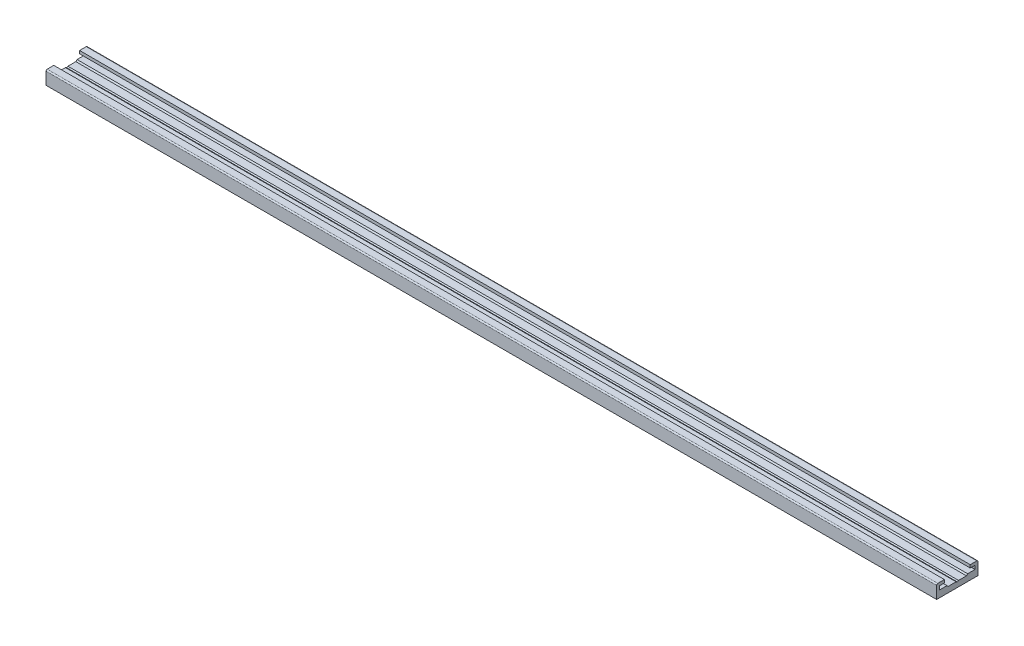
ISO-10303-21;
HEADER;
FILE_DESCRIPTION(('STEP AP214'),'2;1');
FILE_NAME('part.step','',(''),(''),'','','');
FILE_SCHEMA(('AUTOMOTIVE_DESIGN { 1 0 10303 214 1 1 1 1 }'));
ENDSEC;
DATA;
#1=APPLICATION_CONTEXT('core data for automotive mechanical design processes');
#2=APPLICATION_PROTOCOL_DEFINITION('international standard','automotive_design',2000,#1);
#3=PRODUCT_CONTEXT('',#1,'mechanical');
#4=PRODUCT('Part','Part','',(#3));
#5=PRODUCT_RELATED_PRODUCT_CATEGORY('part','',(#4));
#6=PRODUCT_DEFINITION_FORMATION('','',#4);
#7=PRODUCT_DEFINITION_CONTEXT('part definition',#1,'design');
#8=PRODUCT_DEFINITION('design','',#6,#7);
#9=PRODUCT_DEFINITION_SHAPE('','',#8);
#10=(LENGTH_UNIT() NAMED_UNIT(*) SI_UNIT(.MILLI.,.METRE.));
#11=(NAMED_UNIT(*) PLANE_ANGLE_UNIT() SI_UNIT($,.RADIAN.));
#12=(NAMED_UNIT(*) SI_UNIT($,.STERADIAN.) SOLID_ANGLE_UNIT());
#13=UNCERTAINTY_MEASURE_WITH_UNIT(LENGTH_MEASURE(1.E-05),#10,'distance_accuracy_value','');
#14=(GEOMETRIC_REPRESENTATION_CONTEXT(3) GLOBAL_UNCERTAINTY_ASSIGNED_CONTEXT((#13)) GLOBAL_UNIT_ASSIGNED_CONTEXT((#10,
#11,#12)) REPRESENTATION_CONTEXT('',''));
#15=CARTESIAN_POINT('',(0.,0.,0.));
#16=DIRECTION('',(0.,0.,1.));
#17=DIRECTION('',(1.,0.,0.));
#18=AXIS2_PLACEMENT_3D('',#15,#16,#17);
#19=CARTESIAN_POINT('',(366.,-2.75,8.49999999602077));
#20=DIRECTION('',(0.,0.,-1.));
#21=DIRECTION('',(0.,1.,0.));
#22=AXIS2_PLACEMENT_3D('',#19,#20,#21);
#23=PLANE('',#22);
#24=DIRECTION('',(0.,-1.,0.));
#25=VECTOR('',#24,1.);
#26=CARTESIAN_POINT('',(0.,-2.75,8.49999999602077));
#27=LINE('',#26,#25);
#28=CARTESIAN_POINT('',(0.,2.25,8.49999999602078));
#29=VERTEX_POINT('',#28);
#30=CARTESIAN_POINT('',(0.,-2.75,8.49999999602077));
#31=VERTEX_POINT('',#30);
#32=EDGE_CURVE('E207',#29,#31,#27,.T.);
#33=ORIENTED_EDGE('',*,*,#32,.T.);
#34=DIRECTION('',(-1.,0.,0.));
#35=VECTOR('',#34,1.);
#36=CARTESIAN_POINT('',(366.,-2.75,8.49999999602077));
#37=LINE('',#36,#35);
#38=CARTESIAN_POINT('',(366.,-2.75,8.49999999602077));
#39=VERTEX_POINT('',#38);
#40=EDGE_CURVE('E11',#39,#31,#37,.T.);
#41=ORIENTED_EDGE('',*,*,#40,.F.);
#42=DIRECTION('',(0.,-1.,0.));
#43=VECTOR('',#42,1.);
#44=CARTESIAN_POINT('',(366.,-2.75,8.49999999602077));
#45=LINE('',#44,#43);
#46=CARTESIAN_POINT('',(366.,2.25,8.49999999602078));
#47=VERTEX_POINT('',#46);
#48=EDGE_CURVE('E247',#47,#39,#45,.T.);
#49=ORIENTED_EDGE('',*,*,#48,.F.);
#50=DIRECTION('',(-1.,0.,0.));
#51=VECTOR('',#50,1.);
#52=CARTESIAN_POINT('',(366.,2.25,8.49999999602078));
#53=LINE('',#52,#51);
#54=EDGE_CURVE('E203',#47,#29,#53,.T.);
#55=ORIENTED_EDGE('',*,*,#54,.T.);
#56=EDGE_LOOP('',(#33,#41,#49,#55));
#57=FACE_BOUND('',#56,.T.);
#58=ADVANCED_FACE('F33',(#57),#23,.F.);
#59=CARTESIAN_POINT('',(366.,-2.75,8.49999999602077));
#60=DIRECTION('',(0.,1.,0.));
#61=DIRECTION('',(0.,0.,1.));
#62=AXIS2_PLACEMENT_3D('',#59,#60,#61);
#63=PLANE('',#62);
#64=DIRECTION('',(0.,0.,-1.));
#65=VECTOR('',#64,1.);
#66=CARTESIAN_POINT('',(0.,-2.75,8.49999999602077));
#67=LINE('',#66,#65);
#68=CARTESIAN_POINT('',(0.,-2.75,-8.49999999602077));
#69=VERTEX_POINT('',#68);
#70=EDGE_CURVE('E210',#31,#69,#67,.T.);
#71=ORIENTED_EDGE('',*,*,#70,.T.);
#72=DIRECTION('',(-1.,0.,0.));
#73=VECTOR('',#72,1.);
#74=CARTESIAN_POINT('',(366.,-2.75,-8.49999999602077));
#75=LINE('',#74,#73);
#76=CARTESIAN_POINT('',(366.,-2.75,-8.49999999602077));
#77=VERTEX_POINT('',#76);
#78=EDGE_CURVE('E41',#77,#69,#75,.T.);
#79=ORIENTED_EDGE('',*,*,#78,.F.);
#80=DIRECTION('',(0.,0.,-1.));
#81=VECTOR('',#80,1.);
#82=CARTESIAN_POINT('',(366.,-2.75,8.49999999602077));
#83=LINE('',#82,#81);
#84=EDGE_CURVE('E131',#39,#77,#83,.T.);
#85=ORIENTED_EDGE('',*,*,#84,.F.);
#86=ORIENTED_EDGE('',*,*,#40,.T.);
#87=EDGE_LOOP('',(#71,#79,#85,#86));
#88=FACE_BOUND('',#87,.T.);
#89=ADVANCED_FACE('F370',(#88),#63,.F.);
#90=CARTESIAN_POINT('',(366.,-2.75,-8.49999999602077));
#91=DIRECTION('',(0.,0.,1.));
#92=DIRECTION('',(1.,0.,0.));
#93=AXIS2_PLACEMENT_3D('',#90,#91,#92);
#94=PLANE('',#93);
#95=DIRECTION('',(0.,1.,0.));
#96=VECTOR('',#95,1.);
#97=CARTESIAN_POINT('',(0.,-2.75,-8.49999999602077));
#98=LINE('',#97,#96);
#99=CARTESIAN_POINT('',(0.,2.25,-8.49999999602077));
#100=VERTEX_POINT('',#99);
#101=EDGE_CURVE('E212',#69,#100,#98,.T.);
#102=ORIENTED_EDGE('',*,*,#101,.T.);
#103=DIRECTION('',(-1.,0.,0.));
#104=VECTOR('',#103,1.);
#105=CARTESIAN_POINT('',(366.,2.25,-8.49999999602077));
#106=LINE('',#105,#104);
#107=CARTESIAN_POINT('',(366.,2.25,-8.49999999602077));
#108=VERTEX_POINT('',#107);
#109=EDGE_CURVE('E293',#108,#100,#106,.T.);
#110=ORIENTED_EDGE('',*,*,#109,.F.);
#111=DIRECTION('',(0.,1.,0.));
#112=VECTOR('',#111,1.);
#113=CARTESIAN_POINT('',(366.,-2.75,-8.49999999602077));
#114=LINE('',#113,#112);
#115=EDGE_CURVE('E301',#77,#108,#114,.T.);
#116=ORIENTED_EDGE('',*,*,#115,.F.);
#117=ORIENTED_EDGE('',*,*,#78,.T.);
#118=EDGE_LOOP('',(#102,#110,#116,#117));
#119=FACE_BOUND('',#118,.T.);
#120=ADVANCED_FACE('F299',(#119),#94,.F.);
#121=CARTESIAN_POINT('',(366.,2.25,-7.99999999602077));
#122=DIRECTION('',(-1.,0.,0.));
#123=DIRECTION('',(0.,0.,1.));
#124=AXIS2_PLACEMENT_3D('',#121,#122,#123);
#125=CYLINDRICAL_SURFACE('',#124,0.5);
#126=CARTESIAN_POINT('',(0.,2.25,-7.99999999602077));
#127=DIRECTION('',(1.,0.,0.));
#128=DIRECTION('',(0.,0.,-1.));
#129=AXIS2_PLACEMENT_3D('',#126,#127,#128);
#130=CIRCLE('',#129,0.5);
#131=CARTESIAN_POINT('',(0.,2.75,-7.99999999602077));
#132=VERTEX_POINT('',#131);
#133=EDGE_CURVE('E214',#100,#132,#130,.T.);
#134=ORIENTED_EDGE('',*,*,#133,.T.);
#135=DIRECTION('',(-1.,0.,0.));
#136=VECTOR('',#135,1.);
#137=CARTESIAN_POINT('',(366.,2.75,-7.99999999602077));
#138=LINE('',#137,#136);
#139=CARTESIAN_POINT('',(366.,2.75,-7.99999999602077));
#140=VERTEX_POINT('',#139);
#141=EDGE_CURVE('E290',#140,#132,#138,.T.);
#142=ORIENTED_EDGE('',*,*,#141,.F.);
#143=CARTESIAN_POINT('',(366.,2.25,-7.99999999602077));
#144=DIRECTION('',(1.,0.,0.));
#145=DIRECTION('',(0.,0.,-1.));
#146=AXIS2_PLACEMENT_3D('',#143,#144,#145);
#147=CIRCLE('',#146,0.5);
#148=EDGE_CURVE('E319',#108,#140,#147,.T.);
#149=ORIENTED_EDGE('',*,*,#148,.F.);
#150=ORIENTED_EDGE('',*,*,#109,.T.);
#151=EDGE_LOOP('',(#134,#142,#149,#150));
#152=FACE_BOUND('',#151,.T.);
#153=ADVANCED_FACE('F310',(#152),#125,.T.);
#154=CARTESIAN_POINT('',(366.,2.75,-7.99999999602077));
#155=DIRECTION('',(0.,-1.,0.));
#156=DIRECTION('',(0.,0.,-1.));
#157=AXIS2_PLACEMENT_3D('',#154,#155,#156);
#158=PLANE('',#157);
#159=DIRECTION('',(0.,0.,1.));
#160=VECTOR('',#159,1.);
#161=CARTESIAN_POINT('',(0.,2.75,-7.99999999602077));
#162=LINE('',#161,#160);
#163=CARTESIAN_POINT('',(0.,2.75,-5.29999999602078));
#164=VERTEX_POINT('',#163);
#165=EDGE_CURVE('E216',#132,#164,#162,.T.);
#166=ORIENTED_EDGE('',*,*,#165,.T.);
#167=DIRECTION('',(-1.,0.,0.));
#168=VECTOR('',#167,1.);
#169=CARTESIAN_POINT('',(366.,2.75,-5.29999999602078));
#170=LINE('',#169,#168);
#171=CARTESIAN_POINT('',(366.,2.75,-5.29999999602078));
#172=VERTEX_POINT('',#171);
#173=EDGE_CURVE('E287',#172,#164,#170,.T.);
#174=ORIENTED_EDGE('',*,*,#173,.F.);
#175=DIRECTION('',(0.,0.,1.));
#176=VECTOR('',#175,1.);
#177=CARTESIAN_POINT('',(366.,2.75,-7.99999999602077));
#178=LINE('',#177,#176);
#179=EDGE_CURVE('E316',#140,#172,#178,.T.);
#180=ORIENTED_EDGE('',*,*,#179,.F.);
#181=ORIENTED_EDGE('',*,*,#141,.T.);
#182=EDGE_LOOP('',(#166,#174,#180,#181));
#183=FACE_BOUND('',#182,.T.);
#184=ADVANCED_FACE('F314',(#183),#158,.F.);
#185=CARTESIAN_POINT('',(366.,2.75,-5.29999999602078));
#186=DIRECTION('',(0.,0.,-1.));
#187=DIRECTION('',(0.,1.,0.));
#188=AXIS2_PLACEMENT_3D('',#185,#186,#187);
#189=PLANE('',#188);
#190=DIRECTION('',(0.,-1.,0.));
#191=VECTOR('',#190,1.);
#192=CARTESIAN_POINT('',(0.,2.75,-5.29999999602078));
#193=LINE('',#192,#191);
#194=CARTESIAN_POINT('',(0.,1.55,-5.29999999602078));
#195=VERTEX_POINT('',#194);
#196=EDGE_CURVE('E218',#164,#195,#193,.T.);
#197=ORIENTED_EDGE('',*,*,#196,.T.);
#198=DIRECTION('',(-1.,0.,0.));
#199=VECTOR('',#198,1.);
#200=CARTESIAN_POINT('',(366.,1.55,-5.29999999602078));
#201=LINE('',#200,#199);
#202=CARTESIAN_POINT('',(366.,1.55,-5.29999999602078));
#203=VERTEX_POINT('',#202);
#204=EDGE_CURVE('E284',#203,#195,#201,.T.);
#205=ORIENTED_EDGE('',*,*,#204,.F.);
#206=DIRECTION('',(0.,-1.,0.));
#207=VECTOR('',#206,1.);
#208=CARTESIAN_POINT('',(366.,2.75,-5.29999999602078));
#209=LINE('',#208,#207);
#210=EDGE_CURVE('E318',#172,#203,#209,.T.);
#211=ORIENTED_EDGE('',*,*,#210,.F.);
#212=ORIENTED_EDGE('',*,*,#173,.T.);
#213=EDGE_LOOP('',(#197,#205,#211,#212));
#214=FACE_BOUND('',#213,.T.);
#215=ADVANCED_FACE('F383',(#214),#189,.F.);
#216=CARTESIAN_POINT('',(366.,1.55,-5.29999999602078));
#217=DIRECTION('',(0.,1.,0.));
#218=DIRECTION('',(0.,0.,1.));
#219=AXIS2_PLACEMENT_3D('',#216,#217,#218);
#220=PLANE('',#219);
#221=DIRECTION('',(0.,0.,-1.));
#222=VECTOR('',#221,1.);
#223=CARTESIAN_POINT('',(0.,1.55,-5.29999999602078));
#224=LINE('',#223,#222);
#225=CARTESIAN_POINT('',(0.,1.55,-7.29999999801039));
#226=VERTEX_POINT('',#225);
#227=EDGE_CURVE('E220',#195,#226,#224,.T.);
#228=ORIENTED_EDGE('',*,*,#227,.T.);
#229=DIRECTION('',(-1.,0.,0.));
#230=VECTOR('',#229,1.);
#231=CARTESIAN_POINT('',(366.,1.55,-7.29999999801039));
#232=LINE('',#231,#230);
#233=CARTESIAN_POINT('',(366.,1.55,-7.29999999801039));
#234=VERTEX_POINT('',#233);
#235=EDGE_CURVE('E281',#234,#226,#232,.T.);
#236=ORIENTED_EDGE('',*,*,#235,.F.);
#237=DIRECTION('',(0.,0.,-1.));
#238=VECTOR('',#237,1.);
#239=CARTESIAN_POINT('',(366.,1.55,-5.29999999602078));
#240=LINE('',#239,#238);
#241=EDGE_CURVE('E321',#203,#234,#240,.T.);
#242=ORIENTED_EDGE('',*,*,#241,.F.);
#243=ORIENTED_EDGE('',*,*,#204,.T.);
#244=EDGE_LOOP('',(#228,#236,#242,#243));
#245=FACE_BOUND('',#244,.T.);
#246=ADVANCED_FACE('F386',(#245),#220,.F.);
#247=CARTESIAN_POINT('',(366.,1.55,-7.29999999801039));
#248=DIRECTION('',(0.,0.,-1.));
#249=DIRECTION('',(0.,1.,0.));
#250=AXIS2_PLACEMENT_3D('',#247,#248,#249);
#251=PLANE('',#250);
#252=DIRECTION('',(0.,-1.,0.));
#253=VECTOR('',#252,1.);
#254=CARTESIAN_POINT('',(0.,1.55,-7.29999999801039));
#255=LINE('',#254,#253);
#256=CARTESIAN_POINT('',(0.,0.0500000000000036,-7.29999999801039));
#257=VERTEX_POINT('',#256);
#258=EDGE_CURVE('E222',#226,#257,#255,.T.);
#259=ORIENTED_EDGE('',*,*,#258,.T.);
#260=DIRECTION('',(-1.,0.,0.));
#261=VECTOR('',#260,1.);
#262=CARTESIAN_POINT('',(366.,0.0500000000000036,-7.29999999801039));
#263=LINE('',#262,#261);
#264=CARTESIAN_POINT('',(366.,0.0500000000000036,-7.29999999801039));
#265=VERTEX_POINT('',#264);
#266=EDGE_CURVE('E278',#265,#257,#263,.T.);
#267=ORIENTED_EDGE('',*,*,#266,.F.);
#268=DIRECTION('',(0.,-1.,0.));
#269=VECTOR('',#268,1.);
#270=CARTESIAN_POINT('',(366.,1.55,-7.29999999801039));
#271=LINE('',#270,#269);
#272=EDGE_CURVE('E327',#234,#265,#271,.T.);
#273=ORIENTED_EDGE('',*,*,#272,.F.);
#274=ORIENTED_EDGE('',*,*,#235,.T.);
#275=EDGE_LOOP('',(#259,#267,#273,#274));
#276=FACE_BOUND('',#275,.T.);
#277=ADVANCED_FACE('F390',(#276),#251,.F.);
#278=CARTESIAN_POINT('',(366.,0.0500000000000036,-7.29999999801039));
#279=DIRECTION('',(0.,-1.,0.));
#280=DIRECTION('',(0.,0.,-1.));
#281=AXIS2_PLACEMENT_3D('',#278,#279,#280);
#282=PLANE('',#281);
#283=DIRECTION('',(0.,0.,1.));
#284=VECTOR('',#283,1.);
#285=CARTESIAN_POINT('',(0.,0.0500000000000036,-7.29999999801039));
#286=LINE('',#285,#284);
#287=CARTESIAN_POINT('',(0.,0.0500000000000001,-4.24999999801039));
#288=VERTEX_POINT('',#287);
#289=EDGE_CURVE('E224',#257,#288,#286,.T.);
#290=ORIENTED_EDGE('',*,*,#289,.T.);
#291=DIRECTION('',(-1.,0.,0.));
#292=VECTOR('',#291,1.);
#293=CARTESIAN_POINT('',(366.,0.0500000000000001,-4.24999999801039));
#294=LINE('',#293,#292);
#295=CARTESIAN_POINT('',(366.,0.0500000000000001,-4.24999999801039));
#296=VERTEX_POINT('',#295);
#297=EDGE_CURVE('E275',#296,#288,#294,.T.);
#298=ORIENTED_EDGE('',*,*,#297,.F.);
#299=DIRECTION('',(0.,0.,1.));
#300=VECTOR('',#299,1.);
#301=CARTESIAN_POINT('',(366.,0.0500000000000036,-7.29999999801039));
#302=LINE('',#301,#300);
#303=EDGE_CURVE('E329',#265,#296,#302,.T.);
#304=ORIENTED_EDGE('',*,*,#303,.F.);
#305=ORIENTED_EDGE('',*,*,#266,.T.);
#306=EDGE_LOOP('',(#290,#298,#304,#305));
#307=FACE_BOUND('',#306,.T.);
#308=ADVANCED_FACE('F394',(#307),#282,.F.);
#309=CARTESIAN_POINT('',(366.,0.0500000000000001,-4.24999999801039));
#310=DIRECTION('',(0.,-0.707106781186547,-0.707106781186547));
#311=DIRECTION('',(0.,0.707106781186548,-0.707106781186548));
#312=AXIS2_PLACEMENT_3D('',#309,#310,#311);
#313=PLANE('',#312);
#314=DIRECTION('',(0.,-0.707106781186548,0.707106781186548));
#315=VECTOR('',#314,1.);
#316=CARTESIAN_POINT('',(0.,0.0500000000000001,-4.24999999801039));
#317=LINE('',#316,#315);
#318=CARTESIAN_POINT('',(0.,-0.45,-3.74999999801039));
#319=VERTEX_POINT('',#318);
#320=EDGE_CURVE('E226',#288,#319,#317,.T.);
#321=ORIENTED_EDGE('',*,*,#320,.T.);
#322=DIRECTION('',(-1.,0.,0.));
#323=VECTOR('',#322,1.);
#324=CARTESIAN_POINT('',(366.,-0.45,-3.74999999801039));
#325=LINE('',#324,#323);
#326=CARTESIAN_POINT('',(366.,-0.45,-3.74999999801039));
#327=VERTEX_POINT('',#326);
#328=EDGE_CURVE('E272',#327,#319,#325,.T.);
#329=ORIENTED_EDGE('',*,*,#328,.F.);
#330=DIRECTION('',(0.,-0.707106781186548,0.707106781186548));
#331=VECTOR('',#330,1.);
#332=CARTESIAN_POINT('',(366.,0.0500000000000001,-4.24999999801039));
#333=LINE('',#332,#331);
#334=EDGE_CURVE('E331',#296,#327,#333,.T.);
#335=ORIENTED_EDGE('',*,*,#334,.F.);
#336=ORIENTED_EDGE('',*,*,#297,.T.);
#337=EDGE_LOOP('',(#321,#329,#335,#336));
#338=FACE_BOUND('',#337,.T.);
#339=ADVANCED_FACE('F398',(#338),#313,.F.);
#340=CARTESIAN_POINT('',(366.,-0.45,-3.74999999801039));
#341=DIRECTION('',(0.,-1.,0.));
#342=DIRECTION('',(0.,0.,-1.));
#343=AXIS2_PLACEMENT_3D('',#340,#341,#342);
#344=PLANE('',#343);
#345=DIRECTION('',(0.,0.,1.));
#346=VECTOR('',#345,1.);
#347=CARTESIAN_POINT('',(0.,-0.45,-3.74999999801039));
#348=LINE('',#347,#346);
#349=CARTESIAN_POINT('',(0.,-0.45,-0.499999998010386));
#350=VERTEX_POINT('',#349);
#351=EDGE_CURVE('E228',#319,#350,#348,.T.);
#352=ORIENTED_EDGE('',*,*,#351,.T.);
#353=DIRECTION('',(-1.,0.,0.));
#354=VECTOR('',#353,1.);
#355=CARTESIAN_POINT('',(366.,-0.45,-0.499999998010386));
#356=LINE('',#355,#354);
#357=CARTESIAN_POINT('',(366.,-0.45,-0.499999998010386));
#358=VERTEX_POINT('',#357);
#359=EDGE_CURVE('E269',#358,#350,#356,.T.);
#360=ORIENTED_EDGE('',*,*,#359,.F.);
#361=DIRECTION('',(0.,0.,1.));
#362=VECTOR('',#361,1.);
#363=CARTESIAN_POINT('',(366.,-0.45,-3.74999999801039));
#364=LINE('',#363,#362);
#365=EDGE_CURVE('E333',#327,#358,#364,.T.);
#366=ORIENTED_EDGE('',*,*,#365,.F.);
#367=ORIENTED_EDGE('',*,*,#328,.T.);
#368=EDGE_LOOP('',(#352,#360,#366,#367));
#369=FACE_BOUND('',#368,.T.);
#370=ADVANCED_FACE('F402',(#369),#344,.F.);
#371=CARTESIAN_POINT('',(366.,-0.45,-0.499999998010386));
#372=DIRECTION('',(0.,-0.866025403784438,-0.500000000000001));
#373=DIRECTION('',(0.,0.500000000000001,-0.866025403784438));
#374=AXIS2_PLACEMENT_3D('',#371,#372,#373);
#375=PLANE('',#374);
#376=DIRECTION('',(0.,-0.500000000000001,0.866025403784438));
#377=VECTOR('',#376,1.);
#378=CARTESIAN_POINT('',(0.,-0.45,-0.499999998010386));
#379=LINE('',#378,#377);
#380=CARTESIAN_POINT('',(0.,-0.738675133446109,0.));
#381=VERTEX_POINT('',#380);
#382=EDGE_CURVE('E230',#350,#381,#379,.T.);
#383=ORIENTED_EDGE('',*,*,#382,.T.);
#384=DIRECTION('',(-1.,0.,0.));
#385=VECTOR('',#384,1.);
#386=CARTESIAN_POINT('',(366.,-0.738675133446109,0.));
#387=LINE('',#386,#385);
#388=CARTESIAN_POINT('',(366.,-0.738675133446109,0.));
#389=VERTEX_POINT('',#388);
#390=EDGE_CURVE('E266',#389,#381,#387,.T.);
#391=ORIENTED_EDGE('',*,*,#390,.F.);
#392=DIRECTION('',(0.,-0.500000000000001,0.866025403784438));
#393=VECTOR('',#392,1.);
#394=CARTESIAN_POINT('',(366.,-0.45,-0.499999998010386));
#395=LINE('',#394,#393);
#396=EDGE_CURVE('E335',#358,#389,#395,.T.);
#397=ORIENTED_EDGE('',*,*,#396,.F.);
#398=ORIENTED_EDGE('',*,*,#359,.T.);
#399=EDGE_LOOP('',(#383,#391,#397,#398));
#400=FACE_BOUND('',#399,.T.);
#401=ADVANCED_FACE('F406',(#400),#375,.F.);
#402=CARTESIAN_POINT('',(366.,-0.45,0.499999998010387));
#403=DIRECTION('',(0.,-0.866025403784438,0.5));
#404=DIRECTION('',(0.,-0.5,-0.866025403784439));
#405=AXIS2_PLACEMENT_3D('',#402,#403,#404);
#406=PLANE('',#405);
#407=DIRECTION('',(0.,0.5,0.866025403784438));
#408=VECTOR('',#407,1.);
#409=CARTESIAN_POINT('',(0.,-0.45,0.499999998010387));
#410=LINE('',#409,#408);
#411=CARTESIAN_POINT('',(0.,-0.45,0.499999998010387));
#412=VERTEX_POINT('',#411);
#413=EDGE_CURVE('E232',#381,#412,#410,.T.);
#414=ORIENTED_EDGE('',*,*,#413,.T.);
#415=DIRECTION('',(-1.,0.,0.));
#416=VECTOR('',#415,1.);
#417=CARTESIAN_POINT('',(366.,-0.45,0.499999998010387));
#418=LINE('',#417,#416);
#419=CARTESIAN_POINT('',(366.,-0.45,0.499999998010387));
#420=VERTEX_POINT('',#419);
#421=EDGE_CURVE('E263',#420,#412,#418,.T.);
#422=ORIENTED_EDGE('',*,*,#421,.F.);
#423=DIRECTION('',(0.,0.5,0.866025403784438));
#424=VECTOR('',#423,1.);
#425=CARTESIAN_POINT('',(366.,-0.45,0.499999998010387));
#426=LINE('',#425,#424);
#427=EDGE_CURVE('E337',#389,#420,#426,.T.);
#428=ORIENTED_EDGE('',*,*,#427,.F.);
#429=ORIENTED_EDGE('',*,*,#390,.T.);
#430=EDGE_LOOP('',(#414,#422,#428,#429));
#431=FACE_BOUND('',#430,.T.);
#432=ADVANCED_FACE('F410',(#431),#406,.F.);
#433=CARTESIAN_POINT('',(366.,-0.450000000000002,3.74999999801039));
#434=DIRECTION('',(0.,-1.,0.));
#435=DIRECTION('',(0.,0.,-1.));
#436=AXIS2_PLACEMENT_3D('',#433,#434,#435);
#437=PLANE('',#436);
#438=DIRECTION('',(0.,0.,1.));
#439=VECTOR('',#438,1.);
#440=CARTESIAN_POINT('',(0.,-0.450000000000002,3.74999999801039));
#441=LINE('',#440,#439);
#442=CARTESIAN_POINT('',(0.,-0.450000000000002,3.74999999801039));
#443=VERTEX_POINT('',#442);
#444=EDGE_CURVE('E234',#412,#443,#441,.T.);
#445=ORIENTED_EDGE('',*,*,#444,.T.);
#446=DIRECTION('',(-1.,0.,0.));
#447=VECTOR('',#446,1.);
#448=CARTESIAN_POINT('',(366.,-0.450000000000002,3.74999999801039));
#449=LINE('',#448,#447);
#450=CARTESIAN_POINT('',(366.,-0.450000000000002,3.74999999801039));
#451=VERTEX_POINT('',#450);
#452=EDGE_CURVE('E260',#451,#443,#449,.T.);
#453=ORIENTED_EDGE('',*,*,#452,.F.);
#454=DIRECTION('',(0.,0.,1.));
#455=VECTOR('',#454,1.);
#456=CARTESIAN_POINT('',(366.,-0.450000000000002,3.74999999801039));
#457=LINE('',#456,#455);
#458=EDGE_CURVE('E339',#420,#451,#457,.T.);
#459=ORIENTED_EDGE('',*,*,#458,.F.);
#460=ORIENTED_EDGE('',*,*,#421,.T.);
#461=EDGE_LOOP('',(#445,#453,#459,#460));
#462=FACE_BOUND('',#461,.T.);
#463=ADVANCED_FACE('F414',(#462),#437,.F.);
#464=CARTESIAN_POINT('',(366.,0.0499999999999984,4.24999999801039));
#465=DIRECTION('',(0.,-0.707106781186548,0.707106781186547));
#466=DIRECTION('',(0.,-0.707106781186547,-0.707106781186548));
#467=AXIS2_PLACEMENT_3D('',#464,#465,#466);
#468=PLANE('',#467);
#469=DIRECTION('',(0.,0.707106781186547,0.707106781186548));
#470=VECTOR('',#469,1.);
#471=CARTESIAN_POINT('',(0.,0.0499999999999984,4.24999999801039));
#472=LINE('',#471,#470);
#473=CARTESIAN_POINT('',(0.,0.0499999999999984,4.24999999801039));
#474=VERTEX_POINT('',#473);
#475=EDGE_CURVE('E236',#443,#474,#472,.T.);
#476=ORIENTED_EDGE('',*,*,#475,.T.);
#477=DIRECTION('',(-1.,0.,0.));
#478=VECTOR('',#477,1.);
#479=CARTESIAN_POINT('',(366.,0.0499999999999984,4.24999999801039));
#480=LINE('',#479,#478);
#481=CARTESIAN_POINT('',(366.,0.0499999999999984,4.24999999801039));
#482=VERTEX_POINT('',#481);
#483=EDGE_CURVE('E257',#482,#474,#480,.T.);
#484=ORIENTED_EDGE('',*,*,#483,.F.);
#485=DIRECTION('',(0.,0.707106781186547,0.707106781186548));
#486=VECTOR('',#485,1.);
#487=CARTESIAN_POINT('',(366.,0.0499999999999984,4.24999999801039));
#488=LINE('',#487,#486);
#489=EDGE_CURVE('E341',#451,#482,#488,.T.);
#490=ORIENTED_EDGE('',*,*,#489,.F.);
#491=ORIENTED_EDGE('',*,*,#452,.T.);
#492=EDGE_LOOP('',(#476,#484,#490,#491));
#493=FACE_BOUND('',#492,.T.);
#494=ADVANCED_FACE('F418',(#493),#468,.F.);
#495=CARTESIAN_POINT('',(366.,0.050000000000001,7.29999999801039));
#496=DIRECTION('',(0.,-1.,0.));
#497=DIRECTION('',(0.,0.,-1.));
#498=AXIS2_PLACEMENT_3D('',#495,#496,#497);
#499=PLANE('',#498);
#500=DIRECTION('',(0.,0.,1.));
#501=VECTOR('',#500,1.);
#502=CARTESIAN_POINT('',(0.,0.050000000000001,7.29999999801039));
#503=LINE('',#502,#501);
#504=CARTESIAN_POINT('',(0.,0.050000000000001,7.29999999801039));
#505=VERTEX_POINT('',#504);
#506=EDGE_CURVE('E238',#474,#505,#503,.T.);
#507=ORIENTED_EDGE('',*,*,#506,.T.);
#508=DIRECTION('',(-1.,0.,0.));
#509=VECTOR('',#508,1.);
#510=CARTESIAN_POINT('',(366.,0.050000000000001,7.29999999801039));
#511=LINE('',#510,#509);
#512=CARTESIAN_POINT('',(366.,0.050000000000001,7.29999999801039));
#513=VERTEX_POINT('',#512);
#514=EDGE_CURVE('E254',#513,#505,#511,.T.);
#515=ORIENTED_EDGE('',*,*,#514,.F.);
#516=DIRECTION('',(0.,0.,1.));
#517=VECTOR('',#516,1.);
#518=CARTESIAN_POINT('',(366.,0.050000000000001,7.29999999801039));
#519=LINE('',#518,#517);
#520=EDGE_CURVE('E343',#482,#513,#519,.T.);
#521=ORIENTED_EDGE('',*,*,#520,.F.);
#522=ORIENTED_EDGE('',*,*,#483,.T.);
#523=EDGE_LOOP('',(#507,#515,#521,#522));
#524=FACE_BOUND('',#523,.T.);
#525=ADVANCED_FACE('F422',(#524),#499,.F.);
#526=CARTESIAN_POINT('',(366.,1.55,7.29999999801039));
#527=DIRECTION('',(0.,0.,1.));
#528=DIRECTION('',(0.,-1.,0.));
#529=AXIS2_PLACEMENT_3D('',#526,#527,#528);
#530=PLANE('',#529);
#531=DIRECTION('',(0.,1.,0.));
#532=VECTOR('',#531,1.);
#533=CARTESIAN_POINT('',(0.,1.55,7.29999999801039));
#534=LINE('',#533,#532);
#535=CARTESIAN_POINT('',(0.,1.55,7.29999999801039));
#536=VERTEX_POINT('',#535);
#537=EDGE_CURVE('E240',#505,#536,#534,.T.);
#538=ORIENTED_EDGE('',*,*,#537,.T.);
#539=DIRECTION('',(-1.,0.,0.));
#540=VECTOR('',#539,1.);
#541=CARTESIAN_POINT('',(366.,1.55,7.29999999801039));
#542=LINE('',#541,#540);
#543=CARTESIAN_POINT('',(366.,1.55,7.29999999801039));
#544=VERTEX_POINT('',#543);
#545=EDGE_CURVE('E251',#544,#536,#542,.T.);
#546=ORIENTED_EDGE('',*,*,#545,.F.);
#547=DIRECTION('',(0.,1.,0.));
#548=VECTOR('',#547,1.);
#549=CARTESIAN_POINT('',(366.,1.55,7.29999999801039));
#550=LINE('',#549,#548);
#551=EDGE_CURVE('E345',#513,#544,#550,.T.);
#552=ORIENTED_EDGE('',*,*,#551,.F.);
#553=ORIENTED_EDGE('',*,*,#514,.T.);
#554=EDGE_LOOP('',(#538,#546,#552,#553));
#555=FACE_BOUND('',#554,.T.);
#556=ADVANCED_FACE('F351',(#555),#530,.F.);
#557=CARTESIAN_POINT('',(366.,1.55,5.29999999602078));
#558=DIRECTION('',(0.,1.,0.));
#559=DIRECTION('',(0.,0.,1.));
#560=AXIS2_PLACEMENT_3D('',#557,#558,#559);
#561=PLANE('',#560);
#562=DIRECTION('',(0.,0.,-1.));
#563=VECTOR('',#562,1.);
#564=CARTESIAN_POINT('',(0.,1.55,5.29999999602078));
#565=LINE('',#564,#563);
#566=CARTESIAN_POINT('',(0.,1.55,5.29999999602078));
#567=VERTEX_POINT('',#566);
#568=EDGE_CURVE('E242',#536,#567,#565,.T.);
#569=ORIENTED_EDGE('',*,*,#568,.T.);
#570=DIRECTION('',(-1.,0.,0.));
#571=VECTOR('',#570,1.);
#572=CARTESIAN_POINT('',(366.,1.55,5.29999999602078));
#573=LINE('',#572,#571);
#574=CARTESIAN_POINT('',(366.,1.55,5.29999999602078));
#575=VERTEX_POINT('',#574);
#576=EDGE_CURVE('E198',#575,#567,#573,.T.);
#577=ORIENTED_EDGE('',*,*,#576,.F.);
#578=DIRECTION('',(0.,0.,-1.));
#579=VECTOR('',#578,1.);
#580=CARTESIAN_POINT('',(366.,1.55,5.29999999602078));
#581=LINE('',#580,#579);
#582=EDGE_CURVE('E189',#544,#575,#581,.T.);
#583=ORIENTED_EDGE('',*,*,#582,.F.);
#584=ORIENTED_EDGE('',*,*,#545,.T.);
#585=EDGE_LOOP('',(#569,#577,#583,#584));
#586=FACE_BOUND('',#585,.T.);
#587=ADVANCED_FACE('F355',(#586),#561,.F.);
#588=CARTESIAN_POINT('',(366.,2.75,5.29999999602078));
#589=DIRECTION('',(0.,0.,1.));
#590=DIRECTION('',(0.,-1.,0.));
#591=AXIS2_PLACEMENT_3D('',#588,#589,#590);
#592=PLANE('',#591);
#593=DIRECTION('',(0.,1.,0.));
#594=VECTOR('',#593,1.);
#595=CARTESIAN_POINT('',(0.,2.75,5.29999999602078));
#596=LINE('',#595,#594);
#597=CARTESIAN_POINT('',(0.,2.75,5.29999999602078));
#598=VERTEX_POINT('',#597);
#599=EDGE_CURVE('E197',#567,#598,#596,.T.);
#600=ORIENTED_EDGE('',*,*,#599,.T.);
#601=DIRECTION('',(-1.,0.,0.));
#602=VECTOR('',#601,1.);
#603=CARTESIAN_POINT('',(366.,2.75,5.29999999602078));
#604=LINE('',#603,#602);
#605=CARTESIAN_POINT('',(366.,2.75,5.29999999602078));
#606=VERTEX_POINT('',#605);
#607=EDGE_CURVE('E194',#606,#598,#604,.T.);
#608=ORIENTED_EDGE('',*,*,#607,.F.);
#609=DIRECTION('',(0.,1.,0.));
#610=VECTOR('',#609,1.);
#611=CARTESIAN_POINT('',(366.,2.75,5.29999999602078));
#612=LINE('',#611,#610);
#613=EDGE_CURVE('E183',#575,#606,#612,.T.);
#614=ORIENTED_EDGE('',*,*,#613,.F.);
#615=ORIENTED_EDGE('',*,*,#576,.T.);
#616=EDGE_LOOP('',(#600,#608,#614,#615));
#617=FACE_BOUND('',#616,.T.);
#618=ADVANCED_FACE('F195',(#617),#592,.F.);
#619=CARTESIAN_POINT('',(366.,2.75,7.99999999602078));
#620=DIRECTION('',(0.,-1.,0.));
#621=DIRECTION('',(0.,0.,-1.));
#622=AXIS2_PLACEMENT_3D('',#619,#620,#621);
#623=PLANE('',#622);
#624=DIRECTION('',(0.,0.,1.));
#625=VECTOR('',#624,1.);
#626=CARTESIAN_POINT('',(0.,2.75,7.99999999602078));
#627=LINE('',#626,#625);
#628=CARTESIAN_POINT('',(0.,2.75,7.99999999602078));
#629=VERTEX_POINT('',#628);
#630=EDGE_CURVE('E117',#598,#629,#627,.T.);
#631=ORIENTED_EDGE('',*,*,#630,.T.);
#632=DIRECTION('',(-1.,0.,0.));
#633=VECTOR('',#632,1.);
#634=CARTESIAN_POINT('',(366.,2.75,7.99999999602078));
#635=LINE('',#634,#633);
#636=CARTESIAN_POINT('',(366.,2.75,7.99999999602078));
#637=VERTEX_POINT('',#636);
#638=EDGE_CURVE('E199',#637,#629,#635,.T.);
#639=ORIENTED_EDGE('',*,*,#638,.F.);
#640=DIRECTION('',(0.,0.,1.));
#641=VECTOR('',#640,1.);
#642=CARTESIAN_POINT('',(366.,2.75,7.99999999602078));
#643=LINE('',#642,#641);
#644=EDGE_CURVE('E187',#606,#637,#643,.T.);
#645=ORIENTED_EDGE('',*,*,#644,.F.);
#646=ORIENTED_EDGE('',*,*,#607,.T.);
#647=EDGE_LOOP('',(#631,#639,#645,#646));
#648=FACE_BOUND('',#647,.T.);
#649=ADVANCED_FACE('F201',(#648),#623,.F.);
#650=CARTESIAN_POINT('',(366.,2.25,7.99999999602078));
#651=DIRECTION('',(-1.,0.,0.));
#652=DIRECTION('',(0.,0.,1.));
#653=AXIS2_PLACEMENT_3D('',#650,#651,#652);
#654=CYLINDRICAL_SURFACE('',#653,0.5);
#655=CARTESIAN_POINT('',(0.,2.25,7.99999999602078));
#656=DIRECTION('',(1.,0.,0.));
#657=DIRECTION('',(0.,0.,-1.));
#658=AXIS2_PLACEMENT_3D('',#655,#656,#657);
#659=CIRCLE('',#658,0.5);
#660=EDGE_CURVE('E123',#629,#29,#659,.T.);
#661=ORIENTED_EDGE('',*,*,#660,.T.);
#662=ORIENTED_EDGE('',*,*,#54,.F.);
#663=CARTESIAN_POINT('',(366.,2.25,7.99999999602078));
#664=DIRECTION('',(1.,0.,0.));
#665=DIRECTION('',(0.,0.,-1.));
#666=AXIS2_PLACEMENT_3D('',#663,#664,#665);
#667=CIRCLE('',#666,0.5);
#668=EDGE_CURVE('E49',#637,#47,#667,.T.);
#669=ORIENTED_EDGE('',*,*,#668,.F.);
#670=ORIENTED_EDGE('',*,*,#638,.T.);
#671=EDGE_LOOP('',(#661,#662,#669,#670));
#672=FACE_BOUND('',#671,.T.);
#673=ADVANCED_FACE('F359',(#672),#654,.T.);
#674=CARTESIAN_POINT('',(366.,2.25,7.99999999602078));
#675=DIRECTION('',(1.,0.,0.));
#676=DIRECTION('',(0.,0.,-1.));
#677=AXIS2_PLACEMENT_3D('',#674,#675,#676);
#678=PLANE('',#677);
#679=ORIENTED_EDGE('',*,*,#48,.T.);
#680=ORIENTED_EDGE('',*,*,#84,.T.);
#681=ORIENTED_EDGE('',*,*,#115,.T.);
#682=ORIENTED_EDGE('',*,*,#148,.T.);
#683=ORIENTED_EDGE('',*,*,#179,.T.);
#684=ORIENTED_EDGE('',*,*,#210,.T.);
#685=ORIENTED_EDGE('',*,*,#241,.T.);
#686=ORIENTED_EDGE('',*,*,#272,.T.);
#687=ORIENTED_EDGE('',*,*,#303,.T.);
#688=ORIENTED_EDGE('',*,*,#334,.T.);
#689=ORIENTED_EDGE('',*,*,#365,.T.);
#690=ORIENTED_EDGE('',*,*,#396,.T.);
#691=ORIENTED_EDGE('',*,*,#427,.T.);
#692=ORIENTED_EDGE('',*,*,#458,.T.);
#693=ORIENTED_EDGE('',*,*,#489,.T.);
#694=ORIENTED_EDGE('',*,*,#520,.T.);
#695=ORIENTED_EDGE('',*,*,#551,.T.);
#696=ORIENTED_EDGE('',*,*,#582,.T.);
#697=ORIENTED_EDGE('',*,*,#613,.T.);
#698=ORIENTED_EDGE('',*,*,#644,.T.);
#699=ORIENTED_EDGE('',*,*,#668,.T.);
#700=EDGE_LOOP('',(#679,#680,#681,#682,#683,#684,#685,#686,#687,#688,#689,#690,#691,#692,#693,
#694,#695,#696,#697,#698,#699));
#701=FACE_BOUND('',#700,.T.);
#702=ADVANCED_FACE('F185',(#701),#678,.T.);
#703=CARTESIAN_POINT('',(0.,2.25,7.99999999602078));
#704=DIRECTION('',(1.,0.,0.));
#705=DIRECTION('',(0.,0.,-1.));
#706=AXIS2_PLACEMENT_3D('',#703,#704,#705);
#707=PLANE('',#706);
#708=ORIENTED_EDGE('',*,*,#32,.F.);
#709=ORIENTED_EDGE('',*,*,#660,.F.);
#710=ORIENTED_EDGE('',*,*,#630,.F.);
#711=ORIENTED_EDGE('',*,*,#599,.F.);
#712=ORIENTED_EDGE('',*,*,#568,.F.);
#713=ORIENTED_EDGE('',*,*,#537,.F.);
#714=ORIENTED_EDGE('',*,*,#506,.F.);
#715=ORIENTED_EDGE('',*,*,#475,.F.);
#716=ORIENTED_EDGE('',*,*,#444,.F.);
#717=ORIENTED_EDGE('',*,*,#413,.F.);
#718=ORIENTED_EDGE('',*,*,#382,.F.);
#719=ORIENTED_EDGE('',*,*,#351,.F.);
#720=ORIENTED_EDGE('',*,*,#320,.F.);
#721=ORIENTED_EDGE('',*,*,#289,.F.);
#722=ORIENTED_EDGE('',*,*,#258,.F.);
#723=ORIENTED_EDGE('',*,*,#227,.F.);
#724=ORIENTED_EDGE('',*,*,#196,.F.);
#725=ORIENTED_EDGE('',*,*,#165,.F.);
#726=ORIENTED_EDGE('',*,*,#133,.F.);
#727=ORIENTED_EDGE('',*,*,#101,.F.);
#728=ORIENTED_EDGE('',*,*,#70,.F.);
#729=EDGE_LOOP('',(#708,#709,#710,#711,#712,#713,#714,#715,#716,#717,#718,#719,#720,#721,#722,
#723,#724,#725,#726,#727,#728));
#730=FACE_BOUND('',#729,.T.);
#731=ADVANCED_FACE('F305',(#730),#707,.F.);
#732=CLOSED_SHELL('',(#58,#89,#120,#153,#184,#215,#246,#277,#308,#339,#370,#401,#432,#463,#494,
#525,#556,#587,#618,#649,#673,#702,#731));
#733=MANIFOLD_SOLID_BREP('B2',#732);
#734=ADVANCED_BREP_SHAPE_REPRESENTATION('',(#18,#733),#14);
#735=SHAPE_DEFINITION_REPRESENTATION(#9,#734);
ENDSEC;
END-ISO-10303-21;
